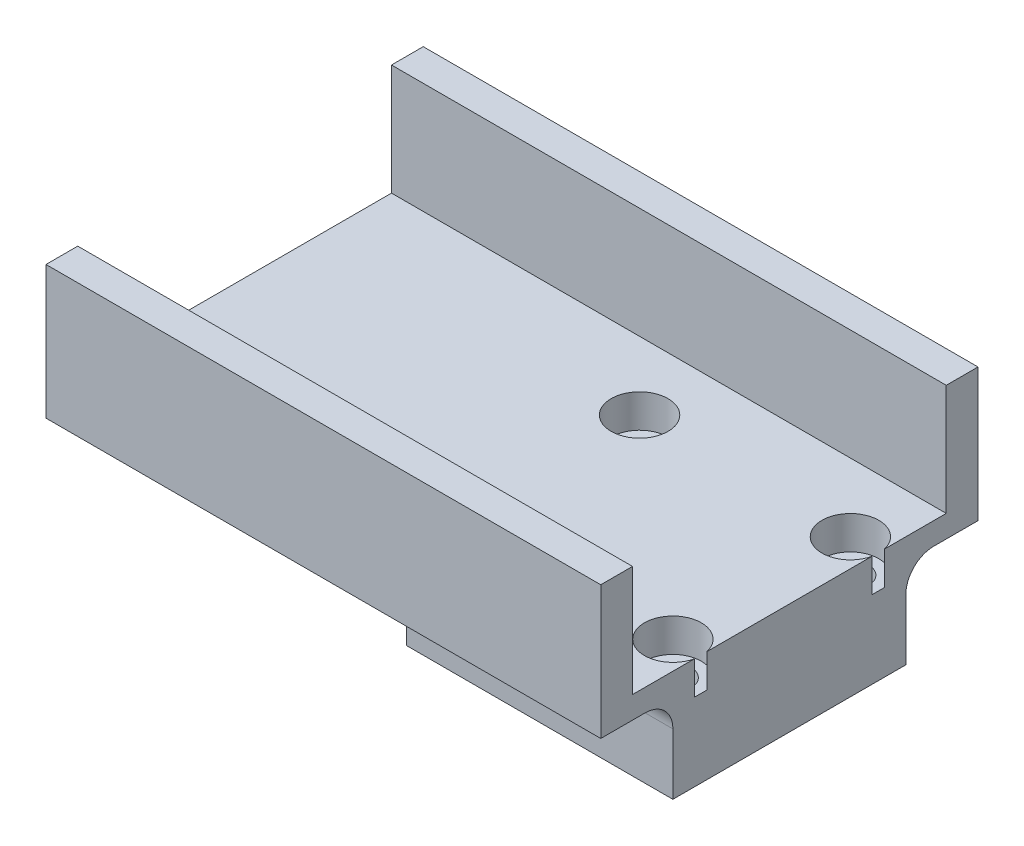
ISO-10303-21;
HEADER;
FILE_DESCRIPTION(('STEP AP214'),'2;1');
FILE_NAME('part.step','',(''),(''),'','','');
FILE_SCHEMA(('AUTOMOTIVE_DESIGN { 1 0 10303 214 1 1 1 1 }'));
ENDSEC;
DATA;
#1=APPLICATION_CONTEXT('core data for automotive mechanical design processes');
#2=APPLICATION_PROTOCOL_DEFINITION('international standard','automotive_design',2000,#1);
#3=PRODUCT_CONTEXT('',#1,'mechanical');
#4=PRODUCT('Part','Part','',(#3));
#5=PRODUCT_RELATED_PRODUCT_CATEGORY('part','',(#4));
#6=PRODUCT_DEFINITION_FORMATION('','',#4);
#7=PRODUCT_DEFINITION_CONTEXT('part definition',#1,'design');
#8=PRODUCT_DEFINITION('design','',#6,#7);
#9=PRODUCT_DEFINITION_SHAPE('','',#8);
#10=(LENGTH_UNIT() NAMED_UNIT(*) SI_UNIT(.MILLI.,.METRE.));
#11=(NAMED_UNIT(*) PLANE_ANGLE_UNIT() SI_UNIT($,.RADIAN.));
#12=(NAMED_UNIT(*) SI_UNIT($,.STERADIAN.) SOLID_ANGLE_UNIT());
#13=UNCERTAINTY_MEASURE_WITH_UNIT(LENGTH_MEASURE(1.E-05),#10,'distance_accuracy_value','');
#14=(GEOMETRIC_REPRESENTATION_CONTEXT(3) GLOBAL_UNCERTAINTY_ASSIGNED_CONTEXT((#13)) GLOBAL_UNIT_ASSIGNED_CONTEXT((#10,
#11,#12)) REPRESENTATION_CONTEXT('',''));
#15=CARTESIAN_POINT('',(0.,0.,0.));
#16=DIRECTION('',(0.,0.,1.));
#17=DIRECTION('',(1.,0.,0.));
#18=AXIS2_PLACEMENT_3D('',#15,#16,#17);
#19=CARTESIAN_POINT('',(-9.50000000000001,8.,-8.));
#20=DIRECTION('',(0.,-1.,0.));
#21=DIRECTION('',(0.,0.,-1.));
#22=AXIS2_PLACEMENT_3D('',#19,#20,#21);
#23=CYLINDRICAL_SURFACE('',#22,1.625);
#24=CARTESIAN_POINT('',(-9.50000000000001,0.,-8.));
#25=DIRECTION('',(0.,1.,0.));
#26=DIRECTION('',(0.,0.,1.));
#27=AXIS2_PLACEMENT_3D('',#24,#25,#26);
#28=CIRCLE('',#27,1.625);
#29=CARTESIAN_POINT('',(-9.50000000000001,0.,-6.375));
#30=VERTEX_POINT('',#29);
#31=EDGE_CURVE('E318',#30,#30,#28,.T.);
#32=ORIENTED_EDGE('',*,*,#31,.F.);
#33=EDGE_LOOP('',(#32));
#34=FACE_BOUND('',#33,.T.);
#35=CARTESIAN_POINT('',(-9.50000000000001,7.,-8.));
#36=DIRECTION('',(0.,1.,0.));
#37=DIRECTION('',(0.,0.,1.));
#38=AXIS2_PLACEMENT_3D('',#35,#36,#37);
#39=CIRCLE('',#38,1.625);
#40=CARTESIAN_POINT('',(-9.50000000000001,7.,-6.375));
#41=VERTEX_POINT('',#40);
#42=EDGE_CURVE('E236',#41,#41,#39,.T.);
#43=ORIENTED_EDGE('',*,*,#42,.T.);
#44=EDGE_LOOP('',(#43));
#45=FACE_BOUND('',#44,.T.);
#46=ADVANCED_FACE('F39',(#34,#45),#23,.F.);
#47=CARTESIAN_POINT('',(9.49999999999999,8.,-8.));
#48=DIRECTION('',(0.,-1.,0.));
#49=DIRECTION('',(0.,0.,-1.));
#50=AXIS2_PLACEMENT_3D('',#47,#48,#49);
#51=CYLINDRICAL_SURFACE('',#50,1.625);
#52=CARTESIAN_POINT('',(9.49999999999999,0.,-8.));
#53=DIRECTION('',(0.,1.,0.));
#54=DIRECTION('',(0.,0.,1.));
#55=AXIS2_PLACEMENT_3D('',#52,#53,#54);
#56=CIRCLE('',#55,1.625);
#57=CARTESIAN_POINT('',(9.49999999999999,0.,-6.375));
#58=VERTEX_POINT('',#57);
#59=EDGE_CURVE('E321',#58,#58,#56,.T.);
#60=ORIENTED_EDGE('',*,*,#59,.F.);
#61=EDGE_LOOP('',(#60));
#62=FACE_BOUND('',#61,.T.);
#63=CARTESIAN_POINT('',(9.49999999999999,7.,-8.));
#64=DIRECTION('',(0.,1.,0.));
#65=DIRECTION('',(0.,0.,1.));
#66=AXIS2_PLACEMENT_3D('',#63,#64,#65);
#67=CIRCLE('',#66,1.625);
#68=CARTESIAN_POINT('',(9.49999999999999,7.,-6.375));
#69=VERTEX_POINT('',#68);
#70=EDGE_CURVE('E239',#69,#69,#67,.T.);
#71=ORIENTED_EDGE('',*,*,#70,.T.);
#72=EDGE_LOOP('',(#71));
#73=FACE_BOUND('',#72,.T.);
#74=ADVANCED_FACE('F414',(#62,#73),#51,.F.);
#75=CARTESIAN_POINT('',(9.5,8.,8.));
#76=DIRECTION('',(0.,-1.,0.));
#77=DIRECTION('',(0.,0.,-1.));
#78=AXIS2_PLACEMENT_3D('',#75,#76,#77);
#79=CYLINDRICAL_SURFACE('',#78,1.625);
#80=CARTESIAN_POINT('',(9.5,0.,8.));
#81=DIRECTION('',(0.,1.,0.));
#82=DIRECTION('',(0.,0.,1.));
#83=AXIS2_PLACEMENT_3D('',#80,#81,#82);
#84=CIRCLE('',#83,1.625);
#85=CARTESIAN_POINT('',(9.5,0.,9.625));
#86=VERTEX_POINT('',#85);
#87=EDGE_CURVE('E324',#86,#86,#84,.T.);
#88=ORIENTED_EDGE('',*,*,#87,.F.);
#89=EDGE_LOOP('',(#88));
#90=FACE_BOUND('',#89,.T.);
#91=CARTESIAN_POINT('',(9.5,7.,8.));
#92=DIRECTION('',(0.,1.,0.));
#93=DIRECTION('',(0.,0.,1.));
#94=AXIS2_PLACEMENT_3D('',#91,#92,#93);
#95=CIRCLE('',#94,1.625);
#96=CARTESIAN_POINT('',(9.5,7.,9.625));
#97=VERTEX_POINT('',#96);
#98=EDGE_CURVE('E241',#97,#97,#95,.T.);
#99=ORIENTED_EDGE('',*,*,#98,.T.);
#100=EDGE_LOOP('',(#99));
#101=FACE_BOUND('',#100,.T.);
#102=ADVANCED_FACE('F421',(#90,#101),#79,.F.);
#103=CARTESIAN_POINT('',(-9.5,8.,8.));
#104=DIRECTION('',(0.,-1.,0.));
#105=DIRECTION('',(0.,0.,-1.));
#106=AXIS2_PLACEMENT_3D('',#103,#104,#105);
#107=CYLINDRICAL_SURFACE('',#106,1.625);
#108=CARTESIAN_POINT('',(-9.5,0.,8.));
#109=DIRECTION('',(0.,1.,0.));
#110=DIRECTION('',(0.,0.,1.));
#111=AXIS2_PLACEMENT_3D('',#108,#109,#110);
#112=CIRCLE('',#111,1.625);
#113=CARTESIAN_POINT('',(-9.5,0.,9.625));
#114=VERTEX_POINT('',#113);
#115=EDGE_CURVE('E327',#114,#114,#112,.T.);
#116=ORIENTED_EDGE('',*,*,#115,.F.);
#117=EDGE_LOOP('',(#116));
#118=FACE_BOUND('',#117,.T.);
#119=CARTESIAN_POINT('',(-9.5,7.,8.));
#120=DIRECTION('',(0.,1.,0.));
#121=DIRECTION('',(0.,0.,1.));
#122=AXIS2_PLACEMENT_3D('',#119,#120,#121);
#123=CIRCLE('',#122,1.625);
#124=CARTESIAN_POINT('',(-9.5,7.,9.625));
#125=VERTEX_POINT('',#124);
#126=EDGE_CURVE('E249',#125,#125,#123,.T.);
#127=ORIENTED_EDGE('',*,*,#126,.T.);
#128=EDGE_LOOP('',(#127));
#129=FACE_BOUND('',#128,.T.);
#130=ADVANCED_FACE('F456',(#118,#129),#107,.F.);
#131=CARTESIAN_POINT('',(0.,10.,0.));
#132=DIRECTION('',(0.,-1.,0.));
#133=DIRECTION('',(0.,0.,-1.));
#134=AXIS2_PLACEMENT_3D('',#131,#132,#133);
#135=PLANE('',#134);
#136=CARTESIAN_POINT('',(-9.5,10.,8.));
#137=DIRECTION('',(0.,1.,0.));
#138=DIRECTION('',(0.,0.,1.));
#139=AXIS2_PLACEMENT_3D('',#136,#137,#138);
#140=CIRCLE('',#139,2.5625);
#141=CARTESIAN_POINT('',(-9.5,10.,10.5625));
#142=VERTEX_POINT('',#141);
#143=EDGE_CURVE('E253',#142,#142,#140,.T.);
#144=ORIENTED_EDGE('',*,*,#143,.F.);
#145=EDGE_LOOP('',(#144));
#146=FACE_BOUND('',#145,.T.);
#147=CARTESIAN_POINT('',(-9.50000000000001,10.,-8.));
#148=DIRECTION('',(0.,1.,0.));
#149=DIRECTION('',(0.,0.,1.));
#150=AXIS2_PLACEMENT_3D('',#147,#148,#149);
#151=CIRCLE('',#150,2.5625);
#152=CARTESIAN_POINT('',(-9.50000000000001,10.,-5.4375));
#153=VERTEX_POINT('',#152);
#154=EDGE_CURVE('E242',#153,#153,#151,.T.);
#155=ORIENTED_EDGE('',*,*,#154,.F.);
#156=EDGE_LOOP('',(#155));
#157=FACE_BOUND('',#156,.T.);
#158=DIRECTION('',(0.,0.,-1.));
#159=VECTOR('',#158,1.);
#160=CARTESIAN_POINT('',(12.,10.,-17.));
#161=LINE('',#160,#159);
#162=CARTESIAN_POINT('',(12.,10.,14.1384072684571));
#163=VERTEX_POINT('',#162);
#164=CARTESIAN_POINT('',(12.,10.,8.56249999999998));
#165=VERTEX_POINT('',#164);
#166=EDGE_CURVE('E176',#163,#165,#161,.T.);
#167=ORIENTED_EDGE('',*,*,#166,.T.);
#168=CARTESIAN_POINT('',(9.5,10.,8.));
#169=DIRECTION('',(0.,1.,0.));
#170=DIRECTION('',(0.,0.,1.));
#171=AXIS2_PLACEMENT_3D('',#168,#169,#170);
#172=CIRCLE('',#171,2.5625);
#173=CARTESIAN_POINT('',(12.,10.,7.43750000000002));
#174=VERTEX_POINT('',#173);
#175=EDGE_CURVE('E163',#174,#165,#172,.T.);
#176=ORIENTED_EDGE('',*,*,#175,.F.);
#177=CARTESIAN_POINT('',(12.,10.,-7.43750000000002));
#178=VERTEX_POINT('',#177);
#179=EDGE_CURVE('E183',#174,#178,#161,.T.);
#180=ORIENTED_EDGE('',*,*,#179,.T.);
#181=CARTESIAN_POINT('',(9.49999999999999,10.,-8.));
#182=DIRECTION('',(0.,1.,0.));
#183=DIRECTION('',(0.,0.,1.));
#184=AXIS2_PLACEMENT_3D('',#181,#182,#183);
#185=CIRCLE('',#184,2.5625);
#186=CARTESIAN_POINT('',(12.,10.,-8.56249999999998));
#187=VERTEX_POINT('',#186);
#188=EDGE_CURVE('E246',#187,#178,#185,.T.);
#189=ORIENTED_EDGE('',*,*,#188,.F.);
#190=CARTESIAN_POINT('',(12.,10.,-14.138407268457));
#191=VERTEX_POINT('',#190);
#192=EDGE_CURVE('E185',#187,#191,#161,.T.);
#193=ORIENTED_EDGE('',*,*,#192,.T.);
#194=DIRECTION('',(1.,0.,0.));
#195=VECTOR('',#194,1.);
#196=CARTESIAN_POINT('',(-38.,10.,-14.138407268457));
#197=LINE('',#196,#195);
#198=CARTESIAN_POINT('',(-38.,10.,-14.138407268457));
#199=VERTEX_POINT('',#198);
#200=EDGE_CURVE('E208',#199,#191,#197,.T.);
#201=ORIENTED_EDGE('',*,*,#200,.F.);
#202=DIRECTION('',(0.,0.,1.));
#203=VECTOR('',#202,1.);
#204=CARTESIAN_POINT('',(-38.,10.,-17.));
#205=LINE('',#204,#203);
#206=CARTESIAN_POINT('',(-38.,10.,14.1384072684571));
#207=VERTEX_POINT('',#206);
#208=EDGE_CURVE('E191',#199,#207,#205,.T.);
#209=ORIENTED_EDGE('',*,*,#208,.T.);
#210=DIRECTION('',(-1.,0.,0.));
#211=VECTOR('',#210,1.);
#212=CARTESIAN_POINT('',(-38.,10.,14.1384072684571));
#213=LINE('',#212,#211);
#214=EDGE_CURVE('E181',#163,#207,#213,.T.);
#215=ORIENTED_EDGE('',*,*,#214,.F.);
#216=EDGE_LOOP('',(#167,#176,#180,#189,#193,#201,#209,#215));
#217=FACE_BOUND('',#216,.T.);
#218=ADVANCED_FACE('F179',(#146,#157,#217),#135,.F.);
#219=CARTESIAN_POINT('',(0.,0.,0.));
#220=DIRECTION('',(0.,-1.,0.));
#221=DIRECTION('',(0.,0.,-1.));
#222=AXIS2_PLACEMENT_3D('',#219,#220,#221);
#223=PLANE('',#222);
#224=ORIENTED_EDGE('',*,*,#87,.T.);
#225=EDGE_LOOP('',(#224));
#226=FACE_BOUND('',#225,.T.);
#227=ORIENTED_EDGE('',*,*,#31,.T.);
#228=EDGE_LOOP('',(#227));
#229=FACE_BOUND('',#228,.T.);
#230=DIRECTION('',(0.,0.,1.));
#231=VECTOR('',#230,1.);
#232=CARTESIAN_POINT('',(-12.,0.,-10.5));
#233=LINE('',#232,#231);
#234=CARTESIAN_POINT('',(-12.,0.,-10.5));
#235=VERTEX_POINT('',#234);
#236=CARTESIAN_POINT('',(-12.,0.,10.5));
#237=VERTEX_POINT('',#236);
#238=EDGE_CURVE('E315',#235,#237,#233,.T.);
#239=ORIENTED_EDGE('',*,*,#238,.F.);
#240=DIRECTION('',(-1.,0.,0.));
#241=VECTOR('',#240,1.);
#242=CARTESIAN_POINT('',(12.,0.,-10.5));
#243=LINE('',#242,#241);
#244=CARTESIAN_POINT('',(12.,0.,-10.5));
#245=VERTEX_POINT('',#244);
#246=EDGE_CURVE('E306',#245,#235,#243,.T.);
#247=ORIENTED_EDGE('',*,*,#246,.F.);
#248=DIRECTION('',(0.,0.,-1.));
#249=VECTOR('',#248,1.);
#250=CARTESIAN_POINT('',(12.,0.,-10.5));
#251=LINE('',#250,#249);
#252=CARTESIAN_POINT('',(12.,0.,10.5));
#253=VERTEX_POINT('',#252);
#254=EDGE_CURVE('E309',#253,#245,#251,.T.);
#255=ORIENTED_EDGE('',*,*,#254,.F.);
#256=DIRECTION('',(1.,0.,0.));
#257=VECTOR('',#256,1.);
#258=CARTESIAN_POINT('',(12.,0.,10.5));
#259=LINE('',#258,#257);
#260=EDGE_CURVE('E312',#237,#253,#259,.T.);
#261=ORIENTED_EDGE('',*,*,#260,.F.);
#262=EDGE_LOOP('',(#239,#247,#255,#261));
#263=FACE_BOUND('',#262,.T.);
#264=ORIENTED_EDGE('',*,*,#59,.T.);
#265=EDGE_LOOP('',(#264));
#266=FACE_BOUND('',#265,.T.);
#267=ORIENTED_EDGE('',*,*,#115,.T.);
#268=EDGE_LOOP('',(#267));
#269=FACE_BOUND('',#268,.T.);
#270=ADVANCED_FACE('F381',(#226,#229,#263,#266,#269),#223,.T.);
#271=CARTESIAN_POINT('',(-12.,8.,-10.5));
#272=DIRECTION('',(1.,0.,0.));
#273=DIRECTION('',(0.,0.,-1.));
#274=AXIS2_PLACEMENT_3D('',#271,#272,#273);
#275=PLANE('',#274);
#276=DIRECTION('',(0.,-1.,0.));
#277=VECTOR('',#276,1.);
#278=CARTESIAN_POINT('',(-12.,8.,10.5));
#279=LINE('',#278,#277);
#280=CARTESIAN_POINT('',(-12.,5.5,10.5));
#281=VERTEX_POINT('',#280);
#282=EDGE_CURVE('E298',#281,#237,#279,.T.);
#283=ORIENTED_EDGE('',*,*,#282,.F.);
#284=DIRECTION('',(0.,0.,1.));
#285=VECTOR('',#284,1.);
#286=CARTESIAN_POINT('',(-12.,5.5,-10.5));
#287=LINE('',#286,#285);
#288=CARTESIAN_POINT('',(-12.,5.5,-10.5));
#289=VERTEX_POINT('',#288);
#290=EDGE_CURVE('E287',#281,#289,#287,.F.);
#291=ORIENTED_EDGE('',*,*,#290,.T.);
#292=DIRECTION('',(0.,-1.,0.));
#293=VECTOR('',#292,1.);
#294=CARTESIAN_POINT('',(-12.,8.,-10.5));
#295=LINE('',#294,#293);
#296=EDGE_CURVE('E304',#289,#235,#295,.T.);
#297=ORIENTED_EDGE('',*,*,#296,.T.);
#298=ORIENTED_EDGE('',*,*,#238,.T.);
#299=EDGE_LOOP('',(#283,#291,#297,#298));
#300=FACE_BOUND('',#299,.T.);
#301=ADVANCED_FACE('F376',(#300),#275,.F.);
#302=CARTESIAN_POINT('',(12.,8.,10.5));
#303=DIRECTION('',(0.,0.,-1.));
#304=DIRECTION('',(-1.,0.,0.));
#305=AXIS2_PLACEMENT_3D('',#302,#303,#304);
#306=PLANE('',#305);
#307=DIRECTION('',(0.,-1.,0.));
#308=VECTOR('',#307,1.);
#309=CARTESIAN_POINT('',(12.,8.,10.5));
#310=LINE('',#309,#308);
#311=CARTESIAN_POINT('',(12.,5.5,10.5));
#312=VERTEX_POINT('',#311);
#313=EDGE_CURVE('E300',#312,#253,#310,.T.);
#314=ORIENTED_EDGE('',*,*,#313,.F.);
#315=DIRECTION('',(1.,0.,0.));
#316=VECTOR('',#315,1.);
#317=CARTESIAN_POINT('',(12.,5.5,10.5));
#318=LINE('',#317,#316);
#319=EDGE_CURVE('E285',#312,#281,#318,.F.);
#320=ORIENTED_EDGE('',*,*,#319,.T.);
#321=ORIENTED_EDGE('',*,*,#282,.T.);
#322=ORIENTED_EDGE('',*,*,#260,.T.);
#323=EDGE_LOOP('',(#314,#320,#321,#322));
#324=FACE_BOUND('',#323,.T.);
#325=ADVANCED_FACE('F373',(#324),#306,.F.);
#326=CARTESIAN_POINT('',(12.,8.,-10.5));
#327=DIRECTION('',(-1.,0.,0.));
#328=DIRECTION('',(0.,0.,1.));
#329=AXIS2_PLACEMENT_3D('',#326,#327,#328);
#330=PLANE('',#329);
#331=DIRECTION('',(0.,0.,-1.));
#332=VECTOR('',#331,1.);
#333=CARTESIAN_POINT('',(12.,7.,-10.5));
#334=LINE('',#333,#332);
#335=CARTESIAN_POINT('',(12.,7.,8.56249999999998));
#336=VERTEX_POINT('',#335);
#337=CARTESIAN_POINT('',(12.,7.,7.43750000000002));
#338=VERTEX_POINT('',#337);
#339=EDGE_CURVE('E178',#336,#338,#334,.T.);
#340=ORIENTED_EDGE('',*,*,#339,.F.);
#341=DIRECTION('',(0.,1.,0.));
#342=VECTOR('',#341,1.);
#343=CARTESIAN_POINT('',(12.,7.,8.56249999999998));
#344=LINE('',#343,#342);
#345=EDGE_CURVE('E11',#336,#165,#344,.T.);
#346=ORIENTED_EDGE('',*,*,#345,.T.);
#347=ORIENTED_EDGE('',*,*,#166,.F.);
#348=DIRECTION('',(0.,-1.,0.));
#349=VECTOR('',#348,1.);
#350=CARTESIAN_POINT('',(12.,20.,14.1384072684571));
#351=LINE('',#350,#349);
#352=CARTESIAN_POINT('',(12.,20.,14.1384072684571));
#353=VERTEX_POINT('',#352);
#354=EDGE_CURVE('E234',#353,#163,#351,.T.);
#355=ORIENTED_EDGE('',*,*,#354,.F.);
#356=DIRECTION('',(0.,0.,-1.));
#357=VECTOR('',#356,1.);
#358=CARTESIAN_POINT('',(12.,20.,17.));
#359=LINE('',#358,#357);
#360=CARTESIAN_POINT('',(12.,20.,17.));
#361=VERTEX_POINT('',#360);
#362=EDGE_CURVE('E226',#361,#353,#359,.T.);
#363=ORIENTED_EDGE('',*,*,#362,.F.);
#364=DIRECTION('',(0.,-1.,0.));
#365=VECTOR('',#364,1.);
#366=CARTESIAN_POINT('',(12.,10.,17.));
#367=LINE('',#366,#365);
#368=CARTESIAN_POINT('',(12.,8.,17.));
#369=VERTEX_POINT('',#368);
#370=EDGE_CURVE('E333',#361,#369,#367,.T.);
#371=ORIENTED_EDGE('',*,*,#370,.T.);
#372=DIRECTION('',(0.,0.,-1.));
#373=VECTOR('',#372,1.);
#374=CARTESIAN_POINT('',(12.,8.,-17.));
#375=LINE('',#374,#373);
#376=CARTESIAN_POINT('',(12.,8.,13.));
#377=VERTEX_POINT('',#376);
#378=EDGE_CURVE('E197',#369,#377,#375,.T.);
#379=ORIENTED_EDGE('',*,*,#378,.T.);
#380=CARTESIAN_POINT('',(12.,5.5,13.));
#381=DIRECTION('',(-1.,0.,0.));
#382=DIRECTION('',(0.,0.,1.));
#383=AXIS2_PLACEMENT_3D('',#380,#381,#382);
#384=CIRCLE('',#383,2.5);
#385=EDGE_CURVE('E266',#377,#312,#384,.T.);
#386=ORIENTED_EDGE('',*,*,#385,.T.);
#387=ORIENTED_EDGE('',*,*,#313,.T.);
#388=ORIENTED_EDGE('',*,*,#254,.T.);
#389=DIRECTION('',(0.,-1.,0.));
#390=VECTOR('',#389,1.);
#391=CARTESIAN_POINT('',(12.,8.,-10.5));
#392=LINE('',#391,#390);
#393=CARTESIAN_POINT('',(12.,5.5,-10.5));
#394=VERTEX_POINT('',#393);
#395=EDGE_CURVE('E302',#394,#245,#392,.T.);
#396=ORIENTED_EDGE('',*,*,#395,.F.);
#397=CARTESIAN_POINT('',(12.,5.5,-13.));
#398=DIRECTION('',(-1.,0.,0.));
#399=DIRECTION('',(0.,0.,1.));
#400=AXIS2_PLACEMENT_3D('',#397,#398,#399);
#401=CIRCLE('',#400,2.5);
#402=CARTESIAN_POINT('',(12.,8.,-13.));
#403=VERTEX_POINT('',#402);
#404=EDGE_CURVE('E283',#394,#403,#401,.T.);
#405=ORIENTED_EDGE('',*,*,#404,.T.);
#406=CARTESIAN_POINT('',(12.,8.,-17.));
#407=VERTEX_POINT('',#406);
#408=EDGE_CURVE('E340',#403,#407,#375,.T.);
#409=ORIENTED_EDGE('',*,*,#408,.T.);
#410=DIRECTION('',(0.,-1.,0.));
#411=VECTOR('',#410,1.);
#412=CARTESIAN_POINT('',(12.,10.,-17.));
#413=LINE('',#412,#411);
#414=CARTESIAN_POINT('',(12.,20.,-17.));
#415=VERTEX_POINT('',#414);
#416=EDGE_CURVE('E187',#415,#407,#413,.T.);
#417=ORIENTED_EDGE('',*,*,#416,.F.);
#418=DIRECTION('',(0.,0.,-1.));
#419=VECTOR('',#418,1.);
#420=CARTESIAN_POINT('',(12.,20.,-17.));
#421=LINE('',#420,#419);
#422=CARTESIAN_POINT('',(12.,20.,-14.138407268457));
#423=VERTEX_POINT('',#422);
#424=EDGE_CURVE('E213',#423,#415,#421,.T.);
#425=ORIENTED_EDGE('',*,*,#424,.F.);
#426=DIRECTION('',(0.,-1.,0.));
#427=VECTOR('',#426,1.);
#428=CARTESIAN_POINT('',(12.,20.,-14.138407268457));
#429=LINE('',#428,#427);
#430=EDGE_CURVE('E204',#423,#191,#429,.T.);
#431=ORIENTED_EDGE('',*,*,#430,.T.);
#432=ORIENTED_EDGE('',*,*,#192,.F.);
#433=DIRECTION('',(0.,1.,0.));
#434=VECTOR('',#433,1.);
#435=CARTESIAN_POINT('',(12.,7.,-8.56249999999998));
#436=LINE('',#435,#434);
#437=CARTESIAN_POINT('',(12.,7.,-8.56249999999998));
#438=VERTEX_POINT('',#437);
#439=EDGE_CURVE('E264',#187,#438,#436,.F.);
#440=ORIENTED_EDGE('',*,*,#439,.T.);
#441=DIRECTION('',(0.,0.,-1.));
#442=VECTOR('',#441,1.);
#443=CARTESIAN_POINT('',(12.,7.,-10.5));
#444=LINE('',#443,#442);
#445=CARTESIAN_POINT('',(12.,7.,-7.43750000000002));
#446=VERTEX_POINT('',#445);
#447=EDGE_CURVE('E237',#446,#438,#444,.T.);
#448=ORIENTED_EDGE('',*,*,#447,.F.);
#449=DIRECTION('',(0.,1.,0.));
#450=VECTOR('',#449,1.);
#451=CARTESIAN_POINT('',(12.,7.,-7.43750000000002));
#452=LINE('',#451,#450);
#453=EDGE_CURVE('E261',#446,#178,#452,.T.);
#454=ORIENTED_EDGE('',*,*,#453,.T.);
#455=ORIENTED_EDGE('',*,*,#179,.F.);
#456=DIRECTION('',(0.,1.,0.));
#457=VECTOR('',#456,1.);
#458=CARTESIAN_POINT('',(12.,7.,7.43750000000002));
#459=LINE('',#458,#457);
#460=EDGE_CURVE('E47',#174,#338,#459,.F.);
#461=ORIENTED_EDGE('',*,*,#460,.T.);
#462=EDGE_LOOP('',(#340,#346,#347,#355,#363,#371,#379,#386,#387,#388,#396,#405,#409,#417,#425,
#431,#432,#440,#448,#454,#455,#461));
#463=FACE_BOUND('',#462,.T.);
#464=ADVANCED_FACE('F174',(#463),#330,.F.);
#465=CARTESIAN_POINT('',(12.,8.,-10.5));
#466=DIRECTION('',(0.,0.,1.));
#467=DIRECTION('',(1.,0.,0.));
#468=AXIS2_PLACEMENT_3D('',#465,#466,#467);
#469=PLANE('',#468);
#470=ORIENTED_EDGE('',*,*,#296,.F.);
#471=DIRECTION('',(-1.,0.,0.));
#472=VECTOR('',#471,1.);
#473=CARTESIAN_POINT('',(12.,5.5,-10.5));
#474=LINE('',#473,#472);
#475=EDGE_CURVE('E289',#289,#394,#474,.F.);
#476=ORIENTED_EDGE('',*,*,#475,.T.);
#477=ORIENTED_EDGE('',*,*,#395,.T.);
#478=ORIENTED_EDGE('',*,*,#246,.T.);
#479=EDGE_LOOP('',(#470,#476,#477,#478));
#480=FACE_BOUND('',#479,.T.);
#481=ADVANCED_FACE('F431',(#480),#469,.F.);
#482=CARTESIAN_POINT('',(0.,8.,0.));
#483=DIRECTION('',(0.,-1.,0.));
#484=DIRECTION('',(0.,0.,-1.));
#485=AXIS2_PLACEMENT_3D('',#482,#483,#484);
#486=PLANE('',#485);
#487=ORIENTED_EDGE('',*,*,#408,.F.);
#488=DIRECTION('',(-1.,0.,0.));
#489=VECTOR('',#488,1.);
#490=CARTESIAN_POINT('',(0.,8.,-13.));
#491=LINE('',#490,#489);
#492=CARTESIAN_POINT('',(-14.5,8.,-13.));
#493=VERTEX_POINT('',#492);
#494=EDGE_CURVE('E291',#403,#493,#491,.T.);
#495=ORIENTED_EDGE('',*,*,#494,.T.);
#496=DIRECTION('',(0.,0.,1.));
#497=VECTOR('',#496,1.);
#498=CARTESIAN_POINT('',(-14.5,8.,0.));
#499=LINE('',#498,#497);
#500=CARTESIAN_POINT('',(-14.5,8.,13.));
#501=VERTEX_POINT('',#500);
#502=EDGE_CURVE('E294',#493,#501,#499,.T.);
#503=ORIENTED_EDGE('',*,*,#502,.T.);
#504=DIRECTION('',(1.,0.,0.));
#505=VECTOR('',#504,1.);
#506=CARTESIAN_POINT('',(0.,8.,13.));
#507=LINE('',#506,#505);
#508=EDGE_CURVE('E296',#501,#377,#507,.T.);
#509=ORIENTED_EDGE('',*,*,#508,.T.);
#510=ORIENTED_EDGE('',*,*,#378,.F.);
#511=DIRECTION('',(1.,0.,0.));
#512=VECTOR('',#511,1.);
#513=CARTESIAN_POINT('',(12.,8.,17.));
#514=LINE('',#513,#512);
#515=CARTESIAN_POINT('',(-38.,8.,17.));
#516=VERTEX_POINT('',#515);
#517=EDGE_CURVE('E341',#516,#369,#514,.T.);
#518=ORIENTED_EDGE('',*,*,#517,.F.);
#519=DIRECTION('',(0.,0.,1.));
#520=VECTOR('',#519,1.);
#521=CARTESIAN_POINT('',(-38.,8.,-17.));
#522=LINE('',#521,#520);
#523=CARTESIAN_POINT('',(-38.,8.,-17.));
#524=VERTEX_POINT('',#523);
#525=EDGE_CURVE('E280',#524,#516,#522,.T.);
#526=ORIENTED_EDGE('',*,*,#525,.F.);
#527=DIRECTION('',(-1.,0.,0.));
#528=VECTOR('',#527,1.);
#529=CARTESIAN_POINT('',(12.,8.,-17.));
#530=LINE('',#529,#528);
#531=EDGE_CURVE('E195',#407,#524,#530,.T.);
#532=ORIENTED_EDGE('',*,*,#531,.F.);
#533=EDGE_LOOP('',(#487,#495,#503,#509,#510,#518,#526,#532));
#534=FACE_BOUND('',#533,.T.);
#535=ADVANCED_FACE('F352',(#534),#486,.T.);
#536=CARTESIAN_POINT('',(-38.,10.,-17.));
#537=DIRECTION('',(1.,0.,0.));
#538=DIRECTION('',(0.,0.,-1.));
#539=AXIS2_PLACEMENT_3D('',#536,#537,#538);
#540=PLANE('',#539);
#541=ORIENTED_EDGE('',*,*,#525,.T.);
#542=DIRECTION('',(0.,-1.,0.));
#543=VECTOR('',#542,1.);
#544=CARTESIAN_POINT('',(-38.,10.,17.));
#545=LINE('',#544,#543);
#546=CARTESIAN_POINT('',(-38.,20.,17.));
#547=VERTEX_POINT('',#546);
#548=EDGE_CURVE('E330',#547,#516,#545,.T.);
#549=ORIENTED_EDGE('',*,*,#548,.F.);
#550=DIRECTION('',(0.,0.,1.));
#551=VECTOR('',#550,1.);
#552=CARTESIAN_POINT('',(-38.,20.,17.));
#553=LINE('',#552,#551);
#554=CARTESIAN_POINT('',(-38.,20.,14.1384072684571));
#555=VERTEX_POINT('',#554);
#556=EDGE_CURVE('E220',#555,#547,#553,.T.);
#557=ORIENTED_EDGE('',*,*,#556,.F.);
#558=DIRECTION('',(0.,-1.,0.));
#559=VECTOR('',#558,1.);
#560=CARTESIAN_POINT('',(-38.,20.,14.1384072684571));
#561=LINE('',#560,#559);
#562=EDGE_CURVE('E230',#555,#207,#561,.T.);
#563=ORIENTED_EDGE('',*,*,#562,.T.);
#564=ORIENTED_EDGE('',*,*,#208,.F.);
#565=DIRECTION('',(0.,-1.,0.));
#566=VECTOR('',#565,1.);
#567=CARTESIAN_POINT('',(-38.,20.,-14.138407268457));
#568=LINE('',#567,#566);
#569=CARTESIAN_POINT('',(-38.,20.,-14.138407268457));
#570=VERTEX_POINT('',#569);
#571=EDGE_CURVE('E200',#570,#199,#568,.T.);
#572=ORIENTED_EDGE('',*,*,#571,.F.);
#573=DIRECTION('',(0.,0.,1.));
#574=VECTOR('',#573,1.);
#575=CARTESIAN_POINT('',(-38.,20.,-17.));
#576=LINE('',#575,#574);
#577=CARTESIAN_POINT('',(-38.,20.,-17.));
#578=VERTEX_POINT('',#577);
#579=EDGE_CURVE('E210',#578,#570,#576,.T.);
#580=ORIENTED_EDGE('',*,*,#579,.F.);
#581=DIRECTION('',(0.,-1.,0.));
#582=VECTOR('',#581,1.);
#583=CARTESIAN_POINT('',(-38.,10.,-17.));
#584=LINE('',#583,#582);
#585=EDGE_CURVE('E182',#578,#524,#584,.T.);
#586=ORIENTED_EDGE('',*,*,#585,.T.);
#587=EDGE_LOOP('',(#541,#549,#557,#563,#564,#572,#580,#586));
#588=FACE_BOUND('',#587,.T.);
#589=ADVANCED_FACE('F345',(#588),#540,.F.);
#590=CARTESIAN_POINT('',(12.,10.,17.));
#591=DIRECTION('',(0.,0.,-1.));
#592=DIRECTION('',(-1.,0.,0.));
#593=AXIS2_PLACEMENT_3D('',#590,#591,#592);
#594=PLANE('',#593);
#595=ORIENTED_EDGE('',*,*,#517,.T.);
#596=ORIENTED_EDGE('',*,*,#370,.F.);
#597=DIRECTION('',(1.,0.,0.));
#598=VECTOR('',#597,1.);
#599=CARTESIAN_POINT('',(-38.,20.,17.));
#600=LINE('',#599,#598);
#601=EDGE_CURVE('E223',#547,#361,#600,.T.);
#602=ORIENTED_EDGE('',*,*,#601,.F.);
#603=ORIENTED_EDGE('',*,*,#548,.T.);
#604=EDGE_LOOP('',(#595,#596,#602,#603));
#605=FACE_BOUND('',#604,.T.);
#606=ADVANCED_FACE('F355',(#605),#594,.F.);
#607=CARTESIAN_POINT('',(12.,10.,-17.));
#608=DIRECTION('',(0.,0.,1.));
#609=DIRECTION('',(1.,0.,0.));
#610=AXIS2_PLACEMENT_3D('',#607,#608,#609);
#611=PLANE('',#610);
#612=ORIENTED_EDGE('',*,*,#531,.T.);
#613=ORIENTED_EDGE('',*,*,#585,.F.);
#614=DIRECTION('',(-1.,0.,0.));
#615=VECTOR('',#614,1.);
#616=CARTESIAN_POINT('',(-38.,20.,-17.));
#617=LINE('',#616,#615);
#618=EDGE_CURVE('E207',#415,#578,#617,.T.);
#619=ORIENTED_EDGE('',*,*,#618,.F.);
#620=ORIENTED_EDGE('',*,*,#416,.T.);
#621=EDGE_LOOP('',(#612,#613,#619,#620));
#622=FACE_BOUND('',#621,.T.);
#623=ADVANCED_FACE('F396',(#622),#611,.F.);
#624=CARTESIAN_POINT('',(0.,5.5,13.));
#625=DIRECTION('',(1.,0.,0.));
#626=DIRECTION('',(0.,0.,-1.));
#627=AXIS2_PLACEMENT_3D('',#624,#625,#626);
#628=CYLINDRICAL_SURFACE('',#627,2.5);
#629=ORIENTED_EDGE('',*,*,#385,.F.);
#630=ORIENTED_EDGE('',*,*,#508,.F.);
#631=CARTESIAN_POINT('',(-14.5,5.5,13.));
#632=DIRECTION('',(0.707106781186548,0.,0.707106781186547));
#633=DIRECTION('',(0.707106781186547,0.,-0.707106781186548));
#634=AXIS2_PLACEMENT_3D('',#631,#632,#633);
#635=ELLIPSE('',#634,3.53553390593274,2.5);
#636=EDGE_CURVE('E277',#281,#501,#635,.T.);
#637=ORIENTED_EDGE('',*,*,#636,.F.);
#638=ORIENTED_EDGE('',*,*,#319,.F.);
#639=EDGE_LOOP('',(#629,#630,#637,#638));
#640=FACE_BOUND('',#639,.T.);
#641=ADVANCED_FACE('F41',(#640),#628,.F.);
#642=CARTESIAN_POINT('',(-14.5,5.5,0.));
#643=DIRECTION('',(0.,0.,1.));
#644=DIRECTION('',(1.,0.,0.));
#645=AXIS2_PLACEMENT_3D('',#642,#643,#644);
#646=CYLINDRICAL_SURFACE('',#645,2.5);
#647=ORIENTED_EDGE('',*,*,#636,.T.);
#648=ORIENTED_EDGE('',*,*,#502,.F.);
#649=CARTESIAN_POINT('',(-14.5,5.5,-13.));
#650=DIRECTION('',(-0.707106781186547,0.,0.707106781186548));
#651=DIRECTION('',(0.707106781186548,0.,0.707106781186547));
#652=AXIS2_PLACEMENT_3D('',#649,#650,#651);
#653=ELLIPSE('',#652,3.53553390593274,2.5);
#654=EDGE_CURVE('E203',#289,#493,#653,.T.);
#655=ORIENTED_EDGE('',*,*,#654,.F.);
#656=ORIENTED_EDGE('',*,*,#290,.F.);
#657=EDGE_LOOP('',(#647,#648,#655,#656));
#658=FACE_BOUND('',#657,.T.);
#659=ADVANCED_FACE('F410',(#658),#646,.F.);
#660=CARTESIAN_POINT('',(0.,5.5,-13.));
#661=DIRECTION('',(-1.,0.,0.));
#662=DIRECTION('',(0.,0.,1.));
#663=AXIS2_PLACEMENT_3D('',#660,#661,#662);
#664=CYLINDRICAL_SURFACE('',#663,2.5);
#665=ORIENTED_EDGE('',*,*,#404,.F.);
#666=ORIENTED_EDGE('',*,*,#475,.F.);
#667=ORIENTED_EDGE('',*,*,#654,.T.);
#668=ORIENTED_EDGE('',*,*,#494,.F.);
#669=EDGE_LOOP('',(#665,#666,#667,#668));
#670=FACE_BOUND('',#669,.T.);
#671=ADVANCED_FACE('F390',(#670),#664,.F.);
#672=CARTESIAN_POINT('',(-38.,20.,-14.138407268457));
#673=DIRECTION('',(0.,0.,-1.));
#674=DIRECTION('',(-1.,0.,0.));
#675=AXIS2_PLACEMENT_3D('',#672,#673,#674);
#676=PLANE('',#675);
#677=ORIENTED_EDGE('',*,*,#200,.T.);
#678=ORIENTED_EDGE('',*,*,#430,.F.);
#679=DIRECTION('',(1.,0.,0.));
#680=VECTOR('',#679,1.);
#681=CARTESIAN_POINT('',(-38.,20.,-14.138407268457));
#682=LINE('',#681,#680);
#683=EDGE_CURVE('E216',#570,#423,#682,.T.);
#684=ORIENTED_EDGE('',*,*,#683,.F.);
#685=ORIENTED_EDGE('',*,*,#571,.T.);
#686=EDGE_LOOP('',(#677,#678,#684,#685));
#687=FACE_BOUND('',#686,.T.);
#688=ADVANCED_FACE('F400',(#687),#676,.F.);
#689=CARTESIAN_POINT('',(0.,20.,0.));
#690=DIRECTION('',(0.,1.,0.));
#691=DIRECTION('',(0.,0.,1.));
#692=AXIS2_PLACEMENT_3D('',#689,#690,#691);
#693=PLANE('',#692);
#694=ORIENTED_EDGE('',*,*,#579,.T.);
#695=ORIENTED_EDGE('',*,*,#683,.T.);
#696=ORIENTED_EDGE('',*,*,#424,.T.);
#697=ORIENTED_EDGE('',*,*,#618,.T.);
#698=EDGE_LOOP('',(#694,#695,#696,#697));
#699=FACE_BOUND('',#698,.T.);
#700=ADVANCED_FACE('F398',(#699),#693,.T.);
#701=CARTESIAN_POINT('',(-38.,20.,14.1384072684571));
#702=DIRECTION('',(0.,0.,1.));
#703=DIRECTION('',(1.,0.,0.));
#704=AXIS2_PLACEMENT_3D('',#701,#702,#703);
#705=PLANE('',#704);
#706=ORIENTED_EDGE('',*,*,#214,.T.);
#707=ORIENTED_EDGE('',*,*,#562,.F.);
#708=DIRECTION('',(-1.,0.,0.));
#709=VECTOR('',#708,1.);
#710=CARTESIAN_POINT('',(-38.,20.,14.1384072684571));
#711=LINE('',#710,#709);
#712=EDGE_CURVE('E228',#353,#555,#711,.T.);
#713=ORIENTED_EDGE('',*,*,#712,.F.);
#714=ORIENTED_EDGE('',*,*,#354,.T.);
#715=EDGE_LOOP('',(#706,#707,#713,#714));
#716=FACE_BOUND('',#715,.T.);
#717=ADVANCED_FACE('F363',(#716),#705,.F.);
#718=CARTESIAN_POINT('',(0.,20.,0.));
#719=DIRECTION('',(0.,-1.,0.));
#720=DIRECTION('',(0.,0.,-1.));
#721=AXIS2_PLACEMENT_3D('',#718,#719,#720);
#722=PLANE('',#721);
#723=ORIENTED_EDGE('',*,*,#556,.T.);
#724=ORIENTED_EDGE('',*,*,#601,.T.);
#725=ORIENTED_EDGE('',*,*,#362,.T.);
#726=ORIENTED_EDGE('',*,*,#712,.T.);
#727=EDGE_LOOP('',(#723,#724,#725,#726));
#728=FACE_BOUND('',#727,.T.);
#729=ADVANCED_FACE('F358',(#728),#722,.F.);
#730=CARTESIAN_POINT('',(-9.5,7.,8.));
#731=DIRECTION('',(0.,1.,0.));
#732=DIRECTION('',(0.,0.,1.));
#733=AXIS2_PLACEMENT_3D('',#730,#731,#732);
#734=CYLINDRICAL_SURFACE('',#733,2.5625);
#735=CARTESIAN_POINT('',(-9.5,7.,8.));
#736=DIRECTION('',(0.,1.,0.));
#737=DIRECTION('',(0.,0.,1.));
#738=AXIS2_PLACEMENT_3D('',#735,#736,#737);
#739=CIRCLE('',#738,2.5625);
#740=CARTESIAN_POINT('',(-9.5,7.,10.5625));
#741=VERTEX_POINT('',#740);
#742=EDGE_CURVE('E250',#741,#741,#739,.T.);
#743=ORIENTED_EDGE('',*,*,#742,.F.);
#744=EDGE_LOOP('',(#743));
#745=FACE_BOUND('',#744,.T.);
#746=ORIENTED_EDGE('',*,*,#143,.T.);
#747=EDGE_LOOP('',(#746));
#748=FACE_BOUND('',#747,.T.);
#749=ADVANCED_FACE('F480',(#745,#748),#734,.F.);
#750=CARTESIAN_POINT('',(-9.5,7.,8.));
#751=DIRECTION('',(0.,1.,0.));
#752=DIRECTION('',(0.,0.,1.));
#753=AXIS2_PLACEMENT_3D('',#750,#751,#752);
#754=PLANE('',#753);
#755=ORIENTED_EDGE('',*,*,#126,.F.);
#756=EDGE_LOOP('',(#755));
#757=FACE_BOUND('',#756,.T.);
#758=ORIENTED_EDGE('',*,*,#742,.T.);
#759=EDGE_LOOP('',(#758));
#760=FACE_BOUND('',#759,.T.);
#761=ADVANCED_FACE('F476',(#757,#760),#754,.T.);
#762=CARTESIAN_POINT('',(9.5,7.,8.));
#763=DIRECTION('',(0.,1.,0.));
#764=DIRECTION('',(0.,0.,1.));
#765=AXIS2_PLACEMENT_3D('',#762,#763,#764);
#766=CYLINDRICAL_SURFACE('',#765,2.5625);
#767=CARTESIAN_POINT('',(9.5,7.,8.));
#768=DIRECTION('',(0.,1.,0.));
#769=DIRECTION('',(0.,0.,1.));
#770=AXIS2_PLACEMENT_3D('',#767,#768,#769);
#771=CIRCLE('',#770,2.5625);
#772=EDGE_CURVE('E53',#338,#336,#771,.T.);
#773=ORIENTED_EDGE('',*,*,#772,.F.);
#774=ORIENTED_EDGE('',*,*,#460,.F.);
#775=ORIENTED_EDGE('',*,*,#175,.T.);
#776=ORIENTED_EDGE('',*,*,#345,.F.);
#777=EDGE_LOOP('',(#773,#774,#775,#776));
#778=FACE_BOUND('',#777,.T.);
#779=ADVANCED_FACE('F164',(#778),#766,.F.);
#780=CARTESIAN_POINT('',(9.5,7.,8.));
#781=DIRECTION('',(0.,1.,0.));
#782=DIRECTION('',(0.,0.,1.));
#783=AXIS2_PLACEMENT_3D('',#780,#781,#782);
#784=PLANE('',#783);
#785=ORIENTED_EDGE('',*,*,#98,.F.);
#786=EDGE_LOOP('',(#785));
#787=FACE_BOUND('',#786,.T.);
#788=ORIENTED_EDGE('',*,*,#339,.T.);
#789=ORIENTED_EDGE('',*,*,#772,.T.);
#790=EDGE_LOOP('',(#788,#789));
#791=FACE_BOUND('',#790,.T.);
#792=ADVANCED_FACE('F467',(#787,#791),#784,.T.);
#793=CARTESIAN_POINT('',(9.49999999999999,7.,-8.));
#794=DIRECTION('',(0.,1.,0.));
#795=DIRECTION('',(0.,0.,1.));
#796=AXIS2_PLACEMENT_3D('',#793,#794,#795);
#797=CYLINDRICAL_SURFACE('',#796,2.5625);
#798=CARTESIAN_POINT('',(9.49999999999999,7.,-8.));
#799=DIRECTION('',(0.,1.,0.));
#800=DIRECTION('',(0.,0.,1.));
#801=AXIS2_PLACEMENT_3D('',#798,#799,#800);
#802=CIRCLE('',#801,2.5625);
#803=EDGE_CURVE('E60',#438,#446,#802,.T.);
#804=ORIENTED_EDGE('',*,*,#803,.F.);
#805=ORIENTED_EDGE('',*,*,#439,.F.);
#806=ORIENTED_EDGE('',*,*,#188,.T.);
#807=ORIENTED_EDGE('',*,*,#453,.F.);
#808=EDGE_LOOP('',(#804,#805,#806,#807));
#809=FACE_BOUND('',#808,.T.);
#810=ADVANCED_FACE('F260',(#809),#797,.F.);
#811=CARTESIAN_POINT('',(9.49999999999999,7.,-8.));
#812=DIRECTION('',(0.,1.,0.));
#813=DIRECTION('',(0.,0.,1.));
#814=AXIS2_PLACEMENT_3D('',#811,#812,#813);
#815=PLANE('',#814);
#816=ORIENTED_EDGE('',*,*,#70,.F.);
#817=EDGE_LOOP('',(#816));
#818=FACE_BOUND('',#817,.T.);
#819=ORIENTED_EDGE('',*,*,#447,.T.);
#820=ORIENTED_EDGE('',*,*,#803,.T.);
#821=EDGE_LOOP('',(#819,#820));
#822=FACE_BOUND('',#821,.T.);
#823=ADVANCED_FACE('F474',(#818,#822),#815,.T.);
#824=CARTESIAN_POINT('',(-9.50000000000001,7.,-8.));
#825=DIRECTION('',(0.,1.,0.));
#826=DIRECTION('',(0.,0.,1.));
#827=AXIS2_PLACEMENT_3D('',#824,#825,#826);
#828=CYLINDRICAL_SURFACE('',#827,2.5625);
#829=CARTESIAN_POINT('',(-9.50000000000001,7.,-8.));
#830=DIRECTION('',(0.,1.,0.));
#831=DIRECTION('',(0.,0.,1.));
#832=AXIS2_PLACEMENT_3D('',#829,#830,#831);
#833=CIRCLE('',#832,2.5625);
#834=CARTESIAN_POINT('',(-9.50000000000001,7.,-5.4375));
#835=VERTEX_POINT('',#834);
#836=EDGE_CURVE('E245',#835,#835,#833,.T.);
#837=ORIENTED_EDGE('',*,*,#836,.F.);
#838=EDGE_LOOP('',(#837));
#839=FACE_BOUND('',#838,.T.);
#840=ORIENTED_EDGE('',*,*,#154,.T.);
#841=EDGE_LOOP('',(#840));
#842=FACE_BOUND('',#841,.T.);
#843=ADVANCED_FACE('F490',(#839,#842),#828,.F.);
#844=CARTESIAN_POINT('',(-9.50000000000001,7.,-8.));
#845=DIRECTION('',(0.,1.,0.));
#846=DIRECTION('',(0.,0.,1.));
#847=AXIS2_PLACEMENT_3D('',#844,#845,#846);
#848=PLANE('',#847);
#849=ORIENTED_EDGE('',*,*,#42,.F.);
#850=EDGE_LOOP('',(#849));
#851=FACE_BOUND('',#850,.T.);
#852=ORIENTED_EDGE('',*,*,#836,.T.);
#853=EDGE_LOOP('',(#852));
#854=FACE_BOUND('',#853,.T.);
#855=ADVANCED_FACE('F487',(#851,#854),#848,.T.);
#856=CLOSED_SHELL('',(#46,#74,#102,#130,#218,#270,#301,#325,#464,#481,#535,#589,#606,#623,#641,
#659,#671,#688,#700,#717,#729,#749,#761,#779,#792,#810,#823,#843,#855));
#857=MANIFOLD_SOLID_BREP('B2',#856);
#858=ADVANCED_BREP_SHAPE_REPRESENTATION('',(#18,#857),#14);
#859=SHAPE_DEFINITION_REPRESENTATION(#9,#858);
ENDSEC;
END-ISO-10303-21;
